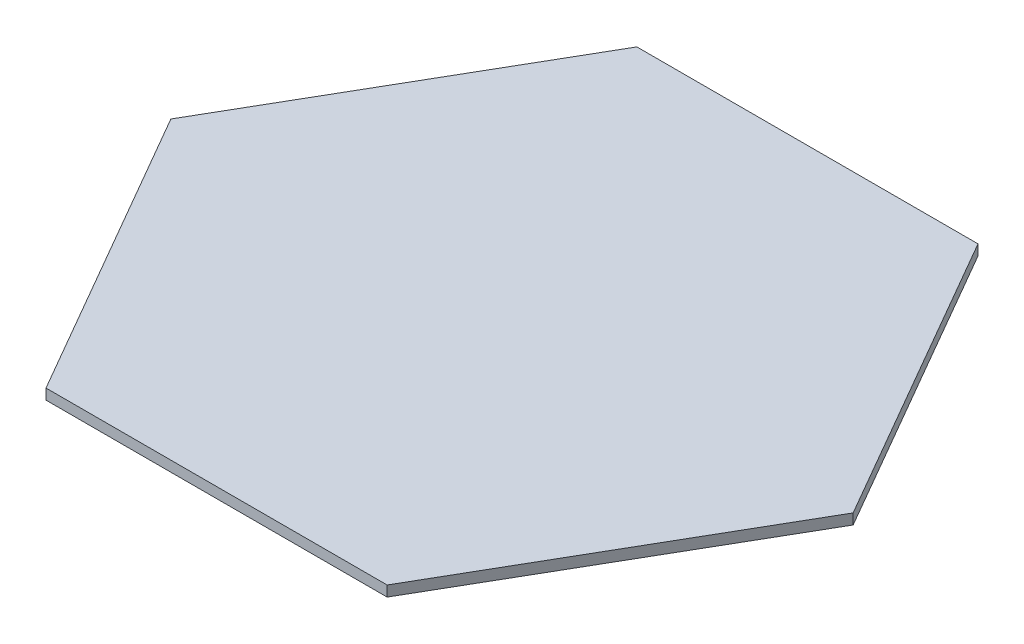
ISO-10303-21;
HEADER;
FILE_DESCRIPTION(('STEP AP214'),'2;1');
FILE_NAME('part.step','',(''),(''),'','','');
FILE_SCHEMA(('AUTOMOTIVE_DESIGN { 1 0 10303 214 1 1 1 1 }'));
ENDSEC;
DATA;
#1=APPLICATION_CONTEXT('core data for automotive mechanical design processes');
#2=APPLICATION_PROTOCOL_DEFINITION('international standard','automotive_design',2000,#1);
#3=PRODUCT_CONTEXT('',#1,'mechanical');
#4=PRODUCT('Part','Part','',(#3));
#5=PRODUCT_RELATED_PRODUCT_CATEGORY('part','',(#4));
#6=PRODUCT_DEFINITION_FORMATION('','',#4);
#7=PRODUCT_DEFINITION_CONTEXT('part definition',#1,'design');
#8=PRODUCT_DEFINITION('design','',#6,#7);
#9=PRODUCT_DEFINITION_SHAPE('','',#8);
#10=(LENGTH_UNIT() NAMED_UNIT(*) SI_UNIT(.MILLI.,.METRE.));
#11=(NAMED_UNIT(*) PLANE_ANGLE_UNIT() SI_UNIT($,.RADIAN.));
#12=(NAMED_UNIT(*) SI_UNIT($,.STERADIAN.) SOLID_ANGLE_UNIT());
#13=UNCERTAINTY_MEASURE_WITH_UNIT(LENGTH_MEASURE(1.E-05),#10,'distance_accuracy_value','');
#14=(GEOMETRIC_REPRESENTATION_CONTEXT(3) GLOBAL_UNCERTAINTY_ASSIGNED_CONTEXT((#13)) GLOBAL_UNIT_ASSIGNED_CONTEXT((#10,
#11,#12)) REPRESENTATION_CONTEXT('',''));
#15=CARTESIAN_POINT('',(0.,0.,0.));
#16=DIRECTION('',(0.,0.,1.));
#17=DIRECTION('',(1.,0.,0.));
#18=AXIS2_PLACEMENT_3D('',#15,#16,#17);
#19=CARTESIAN_POINT('',(32.5,-3.,56.2916512459886));
#20=DIRECTION('',(0.866025403784439,0.,0.499999999999999));
#21=DIRECTION('',(0.5,0.,-0.866025403784439));
#22=AXIS2_PLACEMENT_3D('',#19,#20,#21);
#23=PLANE('',#22);
#24=DIRECTION('',(0.499999999999999,0.,-0.866025403784439));
#25=VECTOR('',#24,1.);
#26=CARTESIAN_POINT('',(32.5,-1.,56.2916512459886));
#27=LINE('',#26,#25);
#28=CARTESIAN_POINT('',(32.5,-1.,56.2916512459886));
#29=VERTEX_POINT('',#28);
#30=CARTESIAN_POINT('',(65.,-1.,0.));
#31=VERTEX_POINT('',#30);
#32=EDGE_CURVE('E121',#29,#31,#27,.T.);
#33=ORIENTED_EDGE('',*,*,#32,.F.);
#34=DIRECTION('',(0.,1.,0.));
#35=VECTOR('',#34,1.);
#36=CARTESIAN_POINT('',(32.5,-3.,56.2916512459886));
#37=LINE('',#36,#35);
#38=CARTESIAN_POINT('',(32.5,-3.,56.2916512459886));
#39=VERTEX_POINT('',#38);
#40=EDGE_CURVE('E11',#39,#29,#37,.T.);
#41=ORIENTED_EDGE('',*,*,#40,.F.);
#42=DIRECTION('',(0.499999999999999,0.,-0.866025403784439));
#43=VECTOR('',#42,1.);
#44=CARTESIAN_POINT('',(32.5,-3.,56.2916512459886));
#45=LINE('',#44,#43);
#46=CARTESIAN_POINT('',(65.,-3.,0.));
#47=VERTEX_POINT('',#46);
#48=EDGE_CURVE('E135',#39,#47,#45,.T.);
#49=ORIENTED_EDGE('',*,*,#48,.T.);
#50=DIRECTION('',(0.,1.,0.));
#51=VECTOR('',#50,1.);
#52=CARTESIAN_POINT('',(65.,-3.,0.));
#53=LINE('',#52,#51);
#54=EDGE_CURVE('E39',#47,#31,#53,.T.);
#55=ORIENTED_EDGE('',*,*,#54,.T.);
#56=EDGE_LOOP('',(#33,#41,#49,#55));
#57=FACE_BOUND('',#56,.T.);
#58=ADVANCED_FACE('F36',(#57),#23,.T.);
#59=CARTESIAN_POINT('',(-32.5,-3.,56.2916512459885));
#60=DIRECTION('',(0.,0.,1.));
#61=DIRECTION('',(1.,0.,0.));
#62=AXIS2_PLACEMENT_3D('',#59,#60,#61);
#63=PLANE('',#62);
#64=DIRECTION('',(1.,0.,0.));
#65=VECTOR('',#64,1.);
#66=CARTESIAN_POINT('',(-32.5,-1.,56.2916512459885));
#67=LINE('',#66,#65);
#68=CARTESIAN_POINT('',(-32.5,-1.,56.2916512459885));
#69=VERTEX_POINT('',#68);
#70=EDGE_CURVE('E133',#69,#29,#67,.T.);
#71=ORIENTED_EDGE('',*,*,#70,.F.);
#72=DIRECTION('',(0.,1.,0.));
#73=VECTOR('',#72,1.);
#74=CARTESIAN_POINT('',(-32.5,-3.,56.2916512459885));
#75=LINE('',#74,#73);
#76=CARTESIAN_POINT('',(-32.5,-3.,56.2916512459885));
#77=VERTEX_POINT('',#76);
#78=EDGE_CURVE('E45',#77,#69,#75,.T.);
#79=ORIENTED_EDGE('',*,*,#78,.F.);
#80=DIRECTION('',(1.,0.,0.));
#81=VECTOR('',#80,1.);
#82=CARTESIAN_POINT('',(-32.5,-3.,56.2916512459885));
#83=LINE('',#82,#81);
#84=EDGE_CURVE('E111',#77,#39,#83,.T.);
#85=ORIENTED_EDGE('',*,*,#84,.T.);
#86=ORIENTED_EDGE('',*,*,#40,.T.);
#87=EDGE_LOOP('',(#71,#79,#85,#86));
#88=FACE_BOUND('',#87,.T.);
#89=ADVANCED_FACE('F143',(#88),#63,.T.);
#90=CARTESIAN_POINT('',(-65.,-3.,0.));
#91=DIRECTION('',(-0.866025403784439,0.,0.5));
#92=DIRECTION('',(0.5,0.,0.866025403784439));
#93=AXIS2_PLACEMENT_3D('',#90,#91,#92);
#94=PLANE('',#93);
#95=DIRECTION('',(0.5,0.,0.866025403784439));
#96=VECTOR('',#95,1.);
#97=CARTESIAN_POINT('',(-65.,-1.,0.));
#98=LINE('',#97,#96);
#99=CARTESIAN_POINT('',(-65.,-1.,0.));
#100=VERTEX_POINT('',#99);
#101=EDGE_CURVE('E98',#100,#69,#98,.T.);
#102=ORIENTED_EDGE('',*,*,#101,.F.);
#103=DIRECTION('',(0.,1.,0.));
#104=VECTOR('',#103,1.);
#105=CARTESIAN_POINT('',(-65.,-3.,0.));
#106=LINE('',#105,#104);
#107=CARTESIAN_POINT('',(-65.,-3.,0.));
#108=VERTEX_POINT('',#107);
#109=EDGE_CURVE('E93',#108,#100,#106,.T.);
#110=ORIENTED_EDGE('',*,*,#109,.F.);
#111=DIRECTION('',(0.5,0.,0.866025403784439));
#112=VECTOR('',#111,1.);
#113=CARTESIAN_POINT('',(-65.,-3.,0.));
#114=LINE('',#113,#112);
#115=EDGE_CURVE('E96',#108,#77,#114,.T.);
#116=ORIENTED_EDGE('',*,*,#115,.T.);
#117=ORIENTED_EDGE('',*,*,#78,.T.);
#118=EDGE_LOOP('',(#102,#110,#116,#117));
#119=FACE_BOUND('',#118,.T.);
#120=ADVANCED_FACE('F95',(#119),#94,.T.);
#121=CARTESIAN_POINT('',(-32.5,-3.,-56.2916512459885));
#122=DIRECTION('',(-0.866025403784439,0.,-0.5));
#123=DIRECTION('',(-0.5,0.,0.866025403784439));
#124=AXIS2_PLACEMENT_3D('',#121,#122,#123);
#125=PLANE('',#124);
#126=DIRECTION('',(-0.5,0.,0.866025403784439));
#127=VECTOR('',#126,1.);
#128=CARTESIAN_POINT('',(-32.5,-1.,-56.2916512459885));
#129=LINE('',#128,#127);
#130=CARTESIAN_POINT('',(-32.5,-1.,-56.2916512459885));
#131=VERTEX_POINT('',#130);
#132=EDGE_CURVE('E130',#131,#100,#129,.T.);
#133=ORIENTED_EDGE('',*,*,#132,.F.);
#134=DIRECTION('',(0.,1.,0.));
#135=VECTOR('',#134,1.);
#136=CARTESIAN_POINT('',(-32.5,-3.,-56.2916512459885));
#137=LINE('',#136,#135);
#138=CARTESIAN_POINT('',(-32.5,-3.,-56.2916512459885));
#139=VERTEX_POINT('',#138);
#140=EDGE_CURVE('E103',#139,#131,#137,.T.);
#141=ORIENTED_EDGE('',*,*,#140,.F.);
#142=DIRECTION('',(-0.5,0.,0.866025403784439));
#143=VECTOR('',#142,1.);
#144=CARTESIAN_POINT('',(-32.5,-3.,-56.2916512459885));
#145=LINE('',#144,#143);
#146=EDGE_CURVE('E109',#139,#108,#145,.T.);
#147=ORIENTED_EDGE('',*,*,#146,.T.);
#148=ORIENTED_EDGE('',*,*,#109,.T.);
#149=EDGE_LOOP('',(#133,#141,#147,#148));
#150=FACE_BOUND('',#149,.T.);
#151=ADVANCED_FACE('F113',(#150),#125,.T.);
#152=CARTESIAN_POINT('',(32.5,-3.,-56.2916512459885));
#153=DIRECTION('',(0.,0.,-1.));
#154=DIRECTION('',(-1.,0.,0.));
#155=AXIS2_PLACEMENT_3D('',#152,#153,#154);
#156=PLANE('',#155);
#157=DIRECTION('',(-1.,0.,0.));
#158=VECTOR('',#157,1.);
#159=CARTESIAN_POINT('',(32.5,-1.,-56.2916512459885));
#160=LINE('',#159,#158);
#161=CARTESIAN_POINT('',(32.5,-1.,-56.2916512459885));
#162=VERTEX_POINT('',#161);
#163=EDGE_CURVE('E127',#162,#131,#160,.T.);
#164=ORIENTED_EDGE('',*,*,#163,.F.);
#165=DIRECTION('',(0.,1.,0.));
#166=VECTOR('',#165,1.);
#167=CARTESIAN_POINT('',(32.5,-3.,-56.2916512459885));
#168=LINE('',#167,#166);
#169=CARTESIAN_POINT('',(32.5,-3.,-56.2916512459885));
#170=VERTEX_POINT('',#169);
#171=EDGE_CURVE('E138',#170,#162,#168,.T.);
#172=ORIENTED_EDGE('',*,*,#171,.F.);
#173=DIRECTION('',(-1.,0.,0.));
#174=VECTOR('',#173,1.);
#175=CARTESIAN_POINT('',(32.5,-3.,-56.2916512459885));
#176=LINE('',#175,#174);
#177=EDGE_CURVE('E114',#170,#139,#176,.T.);
#178=ORIENTED_EDGE('',*,*,#177,.T.);
#179=ORIENTED_EDGE('',*,*,#140,.T.);
#180=EDGE_LOOP('',(#164,#172,#178,#179));
#181=FACE_BOUND('',#180,.T.);
#182=ADVANCED_FACE('F156',(#181),#156,.T.);
#183=CARTESIAN_POINT('',(65.,-3.,0.));
#184=DIRECTION('',(0.866025403784439,0.,-0.5));
#185=DIRECTION('',(-0.5,0.,-0.866025403784439));
#186=AXIS2_PLACEMENT_3D('',#183,#184,#185);
#187=PLANE('',#186);
#188=DIRECTION('',(-0.5,0.,-0.866025403784439));
#189=VECTOR('',#188,1.);
#190=CARTESIAN_POINT('',(65.,-1.,0.));
#191=LINE('',#190,#189);
#192=EDGE_CURVE('E124',#31,#162,#191,.T.);
#193=ORIENTED_EDGE('',*,*,#192,.F.);
#194=ORIENTED_EDGE('',*,*,#54,.F.);
#195=DIRECTION('',(-0.5,0.,-0.866025403784439));
#196=VECTOR('',#195,1.);
#197=CARTESIAN_POINT('',(65.,-3.,0.));
#198=LINE('',#197,#196);
#199=EDGE_CURVE('E116',#47,#170,#198,.T.);
#200=ORIENTED_EDGE('',*,*,#199,.T.);
#201=ORIENTED_EDGE('',*,*,#171,.T.);
#202=EDGE_LOOP('',(#193,#194,#200,#201));
#203=FACE_BOUND('',#202,.T.);
#204=ADVANCED_FACE('F140',(#203),#187,.T.);
#205=CARTESIAN_POINT('',(0.,-3.,0.));
#206=DIRECTION('',(0.,1.,0.));
#207=DIRECTION('',(0.,0.,1.));
#208=AXIS2_PLACEMENT_3D('',#205,#206,#207);
#209=PLANE('',#208);
#210=ORIENTED_EDGE('',*,*,#48,.F.);
#211=ORIENTED_EDGE('',*,*,#84,.F.);
#212=ORIENTED_EDGE('',*,*,#115,.F.);
#213=ORIENTED_EDGE('',*,*,#146,.F.);
#214=ORIENTED_EDGE('',*,*,#177,.F.);
#215=ORIENTED_EDGE('',*,*,#199,.F.);
#216=EDGE_LOOP('',(#210,#211,#212,#213,#214,#215));
#217=FACE_BOUND('',#216,.T.);
#218=ADVANCED_FACE('F107',(#217),#209,.F.);
#219=CARTESIAN_POINT('',(0.,-1.,0.));
#220=DIRECTION('',(0.,1.,0.));
#221=DIRECTION('',(0.,0.,1.));
#222=AXIS2_PLACEMENT_3D('',#219,#220,#221);
#223=PLANE('',#222);
#224=ORIENTED_EDGE('',*,*,#32,.T.);
#225=ORIENTED_EDGE('',*,*,#192,.T.);
#226=ORIENTED_EDGE('',*,*,#163,.T.);
#227=ORIENTED_EDGE('',*,*,#132,.T.);
#228=ORIENTED_EDGE('',*,*,#101,.T.);
#229=ORIENTED_EDGE('',*,*,#70,.T.);
#230=EDGE_LOOP('',(#224,#225,#226,#227,#228,#229));
#231=FACE_BOUND('',#230,.T.);
#232=ADVANCED_FACE('F142',(#231),#223,.T.);
#233=CLOSED_SHELL('',(#58,#89,#120,#151,#182,#204,#218,#232));
#234=MANIFOLD_SOLID_BREP('B2',#233);
#235=ADVANCED_BREP_SHAPE_REPRESENTATION('',(#18,#234),#14);
#236=SHAPE_DEFINITION_REPRESENTATION(#9,#235);
ENDSEC;
END-ISO-10303-21;
